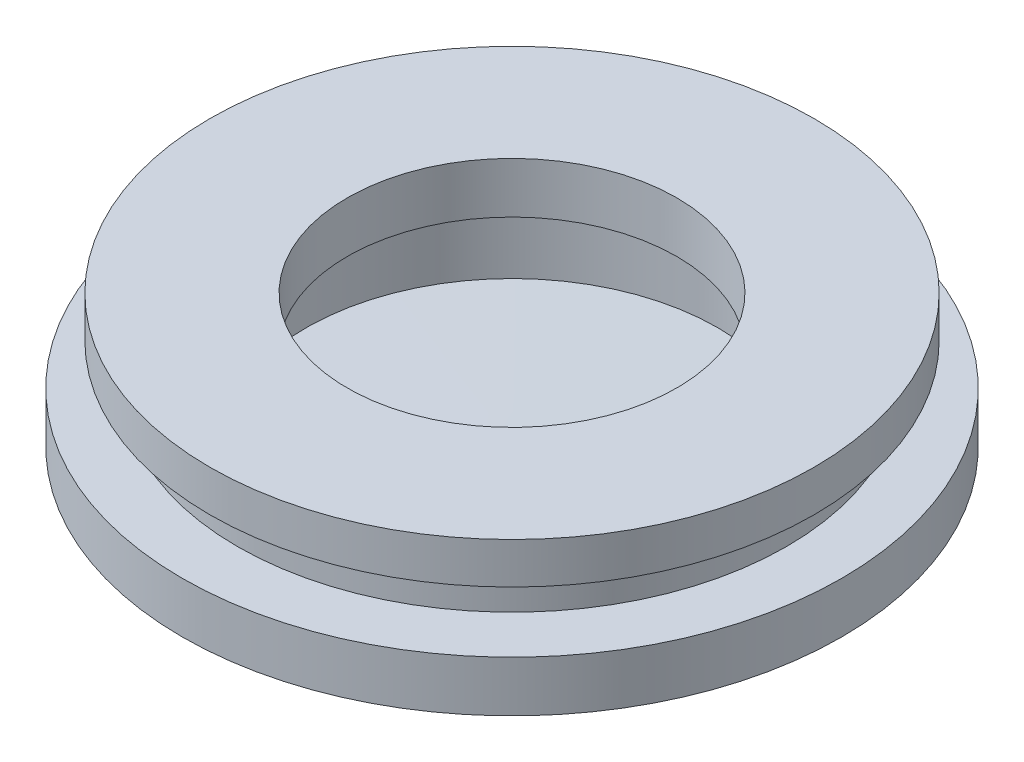
ISO-10303-21;
HEADER;
FILE_DESCRIPTION(('STEP AP214'),'2;1');
FILE_NAME('part.step','',(''),(''),'','','');
FILE_SCHEMA(('AUTOMOTIVE_DESIGN { 1 0 10303 214 1 1 1 1 }'));
ENDSEC;
DATA;
#1=APPLICATION_CONTEXT('core data for automotive mechanical design processes');
#2=APPLICATION_PROTOCOL_DEFINITION('international standard','automotive_design',2000,#1);
#3=PRODUCT_CONTEXT('',#1,'mechanical');
#4=PRODUCT('Part','Part','',(#3));
#5=PRODUCT_RELATED_PRODUCT_CATEGORY('part','',(#4));
#6=PRODUCT_DEFINITION_FORMATION('','',#4);
#7=PRODUCT_DEFINITION_CONTEXT('part definition',#1,'design');
#8=PRODUCT_DEFINITION('design','',#6,#7);
#9=PRODUCT_DEFINITION_SHAPE('','',#8);
#10=(LENGTH_UNIT() NAMED_UNIT(*) SI_UNIT(.MILLI.,.METRE.));
#11=(NAMED_UNIT(*) PLANE_ANGLE_UNIT() SI_UNIT($,.RADIAN.));
#12=(NAMED_UNIT(*) SI_UNIT($,.STERADIAN.) SOLID_ANGLE_UNIT());
#13=UNCERTAINTY_MEASURE_WITH_UNIT(LENGTH_MEASURE(1.E-05),#10,'distance_accuracy_value','');
#14=(GEOMETRIC_REPRESENTATION_CONTEXT(3) GLOBAL_UNCERTAINTY_ASSIGNED_CONTEXT((#13)) GLOBAL_UNIT_ASSIGNED_CONTEXT((#10,
#11,#12)) REPRESENTATION_CONTEXT('',''));
#15=CARTESIAN_POINT('',(0.,0.,0.));
#16=DIRECTION('',(0.,0.,1.));
#17=DIRECTION('',(1.,0.,0.));
#18=AXIS2_PLACEMENT_3D('',#15,#16,#17);
#19=CARTESIAN_POINT('',(0.,4.37012193172007,0.));
#20=DIRECTION('',(0.,1.,0.));
#21=DIRECTION('',(0.,0.,1.));
#22=AXIS2_PLACEMENT_3D('',#19,#20,#21);
#23=CONICAL_SURFACE('',#22,12.0068113276645,1.22173047639604);
#24=CARTESIAN_POINT('',(0.,0.,0.));
#25=VERTEX_POINT('',#24);
#26=VERTEX_LOOP('',#25);
#27=FACE_BOUND('',#26,.T.);
#28=CARTESIAN_POINT('',(0.,4.37012193172007,0.));
#29=DIRECTION('',(0.,-1.,0.));
#30=DIRECTION('',(0.,0.,-1.));
#31=AXIS2_PLACEMENT_3D('',#28,#29,#30);
#32=CIRCLE('',#31,12.0068113276645);
#33=CARTESIAN_POINT('',(0.,4.37012193172007,-12.0068113276645));
#34=VERTEX_POINT('',#33);
#35=EDGE_CURVE('E75',#34,#34,#32,.T.);
#36=ORIENTED_EDGE('',*,*,#35,.T.);
#37=EDGE_LOOP('',(#36));
#38=FACE_BOUND('',#37,.T.);
#39=ADVANCED_FACE('F39',(#27,#38),#23,.T.);
#40=CARTESIAN_POINT('',(0.,9.22012193172007,0.));
#41=DIRECTION('',(0.,-1.,0.));
#42=DIRECTION('',(0.,0.,-1.));
#43=AXIS2_PLACEMENT_3D('',#40,#41,#42);
#44=PLANE('',#43);
#45=CARTESIAN_POINT('',(0.,9.22012193172007,0.));
#46=DIRECTION('',(0.,-1.,0.));
#47=DIRECTION('',(0.,0.,-1.));
#48=AXIS2_PLACEMENT_3D('',#45,#46,#47);
#49=CIRCLE('',#48,6.);
#50=CARTESIAN_POINT('',(0.,9.22012193172007,-6.));
#51=VERTEX_POINT('',#50);
#52=EDGE_CURVE('E42',#51,#51,#49,.F.);
#53=ORIENTED_EDGE('',*,*,#52,.F.);
#54=EDGE_LOOP('',(#53));
#55=FACE_BOUND('',#54,.T.);
#56=CARTESIAN_POINT('',(0.,9.22012193172007,0.));
#57=DIRECTION('',(0.,-1.,0.));
#58=DIRECTION('',(0.,0.,-1.));
#59=AXIS2_PLACEMENT_3D('',#56,#57,#58);
#60=CIRCLE('',#59,11.);
#61=CARTESIAN_POINT('',(0.,9.22012193172007,-11.));
#62=VERTEX_POINT('',#61);
#63=EDGE_CURVE('E11',#62,#62,#60,.T.);
#64=ORIENTED_EDGE('',*,*,#63,.F.);
#65=EDGE_LOOP('',(#64));
#66=FACE_BOUND('',#65,.T.);
#67=ADVANCED_FACE('F100',(#55,#66),#44,.F.);
#68=CARTESIAN_POINT('',(0.,0.,0.));
#69=DIRECTION('',(0.,-1.,0.));
#70=DIRECTION('',(0.,0.,-1.));
#71=AXIS2_PLACEMENT_3D('',#68,#69,#70);
#72=CYLINDRICAL_SURFACE('',#71,11.);
#73=CARTESIAN_POINT('',(0.,7.72012193172007,0.));
#74=DIRECTION('',(0.,-1.,0.));
#75=DIRECTION('',(0.,0.,-1.));
#76=AXIS2_PLACEMENT_3D('',#73,#74,#75);
#77=CIRCLE('',#76,11.);
#78=CARTESIAN_POINT('',(0.,7.72012193172007,-11.));
#79=VERTEX_POINT('',#78);
#80=EDGE_CURVE('E48',#79,#79,#77,.T.);
#81=ORIENTED_EDGE('',*,*,#80,.F.);
#82=EDGE_LOOP('',(#81));
#83=FACE_BOUND('',#82,.T.);
#84=ORIENTED_EDGE('',*,*,#63,.T.);
#85=EDGE_LOOP('',(#84));
#86=FACE_BOUND('',#85,.T.);
#87=ADVANCED_FACE('F97',(#83,#86),#72,.T.);
#88=CARTESIAN_POINT('',(-11.,7.72012193172007,0.));
#89=DIRECTION('',(0.,1.,0.));
#90=DIRECTION('',(0.,0.,1.));
#91=AXIS2_PLACEMENT_3D('',#88,#89,#90);
#92=PLANE('',#91);
#93=CARTESIAN_POINT('',(0.,7.72012193172007,0.));
#94=DIRECTION('',(0.,-1.,0.));
#95=DIRECTION('',(0.,0.,-1.));
#96=AXIS2_PLACEMENT_3D('',#93,#94,#95);
#97=CIRCLE('',#96,10.);
#98=CARTESIAN_POINT('',(0.,7.72012193172007,-10.));
#99=VERTEX_POINT('',#98);
#100=EDGE_CURVE('E87',#99,#99,#97,.T.);
#101=ORIENTED_EDGE('',*,*,#100,.F.);
#102=EDGE_LOOP('',(#101));
#103=FACE_BOUND('',#102,.T.);
#104=ORIENTED_EDGE('',*,*,#80,.T.);
#105=EDGE_LOOP('',(#104));
#106=FACE_BOUND('',#105,.T.);
#107=ADVANCED_FACE('F95',(#103,#106),#92,.F.);
#108=CARTESIAN_POINT('',(0.,0.,0.));
#109=DIRECTION('',(0.,-1.,0.));
#110=DIRECTION('',(0.,0.,-1.));
#111=AXIS2_PLACEMENT_3D('',#108,#109,#110);
#112=CYLINDRICAL_SURFACE('',#111,10.);
#113=CARTESIAN_POINT('',(0.,6.22012193172007,0.));
#114=DIRECTION('',(0.,-1.,0.));
#115=DIRECTION('',(0.,0.,-1.));
#116=AXIS2_PLACEMENT_3D('',#113,#114,#115);
#117=CIRCLE('',#116,10.);
#118=CARTESIAN_POINT('',(0.,6.22012193172007,-10.));
#119=VERTEX_POINT('',#118);
#120=EDGE_CURVE('E83',#119,#119,#117,.T.);
#121=ORIENTED_EDGE('',*,*,#120,.F.);
#122=EDGE_LOOP('',(#121));
#123=FACE_BOUND('',#122,.T.);
#124=ORIENTED_EDGE('',*,*,#100,.T.);
#125=EDGE_LOOP('',(#124));
#126=FACE_BOUND('',#125,.T.);
#127=ADVANCED_FACE('F113',(#123,#126),#112,.T.);
#128=CARTESIAN_POINT('',(-10.,6.22012193172007,0.));
#129=DIRECTION('',(0.,-1.,0.));
#130=DIRECTION('',(0.,0.,-1.));
#131=AXIS2_PLACEMENT_3D('',#128,#129,#130);
#132=PLANE('',#131);
#133=CARTESIAN_POINT('',(0.,6.22012193172007,0.));
#134=DIRECTION('',(0.,-1.,0.));
#135=DIRECTION('',(0.,0.,-1.));
#136=AXIS2_PLACEMENT_3D('',#133,#134,#135);
#137=CIRCLE('',#136,12.0068113276645);
#138=CARTESIAN_POINT('',(0.,6.22012193172007,-12.0068113276645));
#139=VERTEX_POINT('',#138);
#140=EDGE_CURVE('E79',#139,#139,#137,.T.);
#141=ORIENTED_EDGE('',*,*,#140,.F.);
#142=EDGE_LOOP('',(#141));
#143=FACE_BOUND('',#142,.T.);
#144=ORIENTED_EDGE('',*,*,#120,.T.);
#145=EDGE_LOOP('',(#144));
#146=FACE_BOUND('',#145,.T.);
#147=ADVANCED_FACE('F117',(#143,#146),#132,.F.);
#148=CARTESIAN_POINT('',(0.,0.,0.));
#149=DIRECTION('',(0.,-1.,0.));
#150=DIRECTION('',(0.,0.,-1.));
#151=AXIS2_PLACEMENT_3D('',#148,#149,#150);
#152=CYLINDRICAL_SURFACE('',#151,12.0068113276645);
#153=ORIENTED_EDGE('',*,*,#35,.F.);
#154=EDGE_LOOP('',(#153));
#155=FACE_BOUND('',#154,.T.);
#156=ORIENTED_EDGE('',*,*,#140,.T.);
#157=EDGE_LOOP('',(#156));
#158=FACE_BOUND('',#157,.T.);
#159=ADVANCED_FACE('F121',(#155,#158),#152,.T.);
#160=CARTESIAN_POINT('',(0.,4.44110581254189,0.));
#161=DIRECTION('',(0.,-1.,0.));
#162=DIRECTION('',(0.,0.,-1.));
#163=AXIS2_PLACEMENT_3D('',#160,#161,#162);
#164=CYLINDRICAL_SURFACE('',#163,6.);
#165=CARTESIAN_POINT('',(0.,7.37012193172007,0.));
#166=DIRECTION('',(0.,-1.,0.));
#167=DIRECTION('',(0.,0.,-1.));
#168=AXIS2_PLACEMENT_3D('',#165,#166,#167);
#169=CIRCLE('',#168,6.);
#170=CARTESIAN_POINT('',(0.,7.37012193172007,-6.));
#171=VERTEX_POINT('',#170);
#172=EDGE_CURVE('E69',#171,#171,#169,.T.);
#173=ORIENTED_EDGE('',*,*,#172,.T.);
#174=EDGE_LOOP('',(#173));
#175=FACE_BOUND('',#174,.T.);
#176=ORIENTED_EDGE('',*,*,#52,.T.);
#177=EDGE_LOOP('',(#176));
#178=FACE_BOUND('',#177,.T.);
#179=ADVANCED_FACE('F58',(#175,#178),#164,.F.);
#180=CARTESIAN_POINT('',(0.,4.37012193172007,0.));
#181=DIRECTION('',(0.,-1.,0.));
#182=DIRECTION('',(0.,0.,-1.));
#183=AXIS2_PLACEMENT_3D('',#180,#181,#182);
#184=CONICAL_SURFACE('',#183,7.5,1.56133209193811);
#185=CARTESIAN_POINT('',(0.,4.44110581254189,0.));
#186=VERTEX_POINT('',#185);
#187=VERTEX_LOOP('',#186);
#188=FACE_BOUND('',#187,.T.);
#189=CARTESIAN_POINT('',(0.,4.37012193172007,0.));
#190=DIRECTION('',(0.,-1.,0.));
#191=DIRECTION('',(0.,0.,-1.));
#192=AXIS2_PLACEMENT_3D('',#189,#190,#191);
#193=CIRCLE('',#192,7.5);
#194=CARTESIAN_POINT('',(0.,4.37012193172007,-7.5));
#195=VERTEX_POINT('',#194);
#196=EDGE_CURVE('E62',#195,#195,#193,.T.);
#197=ORIENTED_EDGE('',*,*,#196,.F.);
#198=EDGE_LOOP('',(#197));
#199=FACE_BOUND('',#198,.T.);
#200=ADVANCED_FACE('F54',(#188,#199),#184,.T.);
#201=CARTESIAN_POINT('',(-6.,7.37012193172007,0.));
#202=DIRECTION('',(0.,-1.,0.));
#203=DIRECTION('',(0.,0.,-1.));
#204=AXIS2_PLACEMENT_3D('',#201,#202,#203);
#205=PLANE('',#204);
#206=CARTESIAN_POINT('',(0.,7.37012193172007,0.));
#207=DIRECTION('',(0.,-1.,0.));
#208=DIRECTION('',(0.,0.,-1.));
#209=AXIS2_PLACEMENT_3D('',#206,#207,#208);
#210=CIRCLE('',#209,7.5);
#211=CARTESIAN_POINT('',(0.,7.37012193172007,-7.5));
#212=VERTEX_POINT('',#211);
#213=EDGE_CURVE('E65',#212,#212,#210,.T.);
#214=ORIENTED_EDGE('',*,*,#213,.T.);
#215=EDGE_LOOP('',(#214));
#216=FACE_BOUND('',#215,.T.);
#217=ORIENTED_EDGE('',*,*,#172,.F.);
#218=EDGE_LOOP('',(#217));
#219=FACE_BOUND('',#218,.T.);
#220=ADVANCED_FACE('F57',(#216,#219),#205,.T.);
#221=CARTESIAN_POINT('',(0.,4.44110581254189,0.));
#222=DIRECTION('',(0.,-1.,0.));
#223=DIRECTION('',(0.,0.,-1.));
#224=AXIS2_PLACEMENT_3D('',#221,#222,#223);
#225=CYLINDRICAL_SURFACE('',#224,7.5);
#226=ORIENTED_EDGE('',*,*,#196,.T.);
#227=EDGE_LOOP('',(#226));
#228=FACE_BOUND('',#227,.T.);
#229=ORIENTED_EDGE('',*,*,#213,.F.);
#230=EDGE_LOOP('',(#229));
#231=FACE_BOUND('',#230,.T.);
#232=ADVANCED_FACE('F131',(#228,#231),#225,.F.);
#233=CLOSED_SHELL('',(#39,#67,#87,#107,#127,#147,#159,#179,#200,#220,#232));
#234=MANIFOLD_SOLID_BREP('B2',#233);
#235=ADVANCED_BREP_SHAPE_REPRESENTATION('',(#18,#234),#14);
#236=SHAPE_DEFINITION_REPRESENTATION(#9,#235);
ENDSEC;
END-ISO-10303-21;
